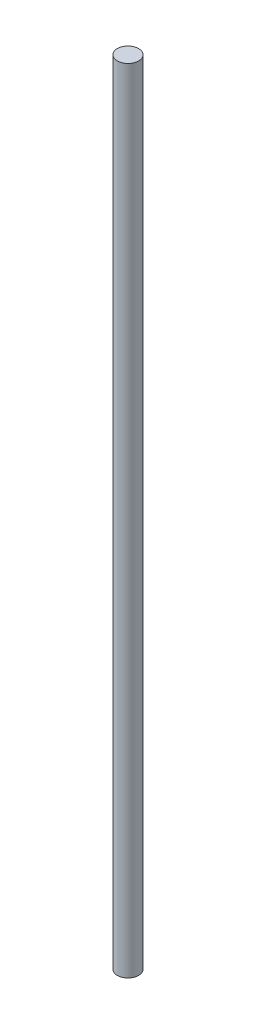
ISO-10303-21;
HEADER;
FILE_DESCRIPTION(('STEP AP214'),'2;1');
FILE_NAME('part.step','',(''),(''),'','','');
FILE_SCHEMA(('AUTOMOTIVE_DESIGN { 1 0 10303 214 1 1 1 1 }'));
ENDSEC;
DATA;
#1=APPLICATION_CONTEXT('core data for automotive mechanical design processes');
#2=APPLICATION_PROTOCOL_DEFINITION('international standard','automotive_design',2000,#1);
#3=PRODUCT_CONTEXT('',#1,'mechanical');
#4=PRODUCT('Part','Part','',(#3));
#5=PRODUCT_RELATED_PRODUCT_CATEGORY('part','',(#4));
#6=PRODUCT_DEFINITION_FORMATION('','',#4);
#7=PRODUCT_DEFINITION_CONTEXT('part definition',#1,'design');
#8=PRODUCT_DEFINITION('design','',#6,#7);
#9=PRODUCT_DEFINITION_SHAPE('','',#8);
#10=(LENGTH_UNIT() NAMED_UNIT(*) SI_UNIT(.MILLI.,.METRE.));
#11=(NAMED_UNIT(*) PLANE_ANGLE_UNIT() SI_UNIT($,.RADIAN.));
#12=(NAMED_UNIT(*) SI_UNIT($,.STERADIAN.) SOLID_ANGLE_UNIT());
#13=UNCERTAINTY_MEASURE_WITH_UNIT(LENGTH_MEASURE(1.E-05),#10,'distance_accuracy_value','');
#14=(GEOMETRIC_REPRESENTATION_CONTEXT(3) GLOBAL_UNCERTAINTY_ASSIGNED_CONTEXT((#13)) GLOBAL_UNIT_ASSIGNED_CONTEXT((#10,
#11,#12)) REPRESENTATION_CONTEXT('',''));
#15=CARTESIAN_POINT('',(0.,0.,0.));
#16=DIRECTION('',(0.,0.,1.));
#17=DIRECTION('',(1.,0.,0.));
#18=AXIS2_PLACEMENT_3D('',#15,#16,#17);
#19=CARTESIAN_POINT('',(0.,234.95,0.));
#20=DIRECTION('',(0.,-1.,0.));
#21=DIRECTION('',(0.,0.,-1.));
#22=AXIS2_PLACEMENT_3D('',#19,#20,#21);
#23=CYLINDRICAL_SURFACE('',#22,3.175);
#24=CARTESIAN_POINT('',(0.,234.95,0.));
#25=DIRECTION('',(0.,1.,0.));
#26=DIRECTION('',(0.,0.,1.));
#27=AXIS2_PLACEMENT_3D('',#24,#25,#26);
#28=CIRCLE('',#27,3.175);
#29=CARTESIAN_POINT('',(0.,234.95,3.175));
#30=VERTEX_POINT('',#29);
#31=EDGE_CURVE('E10',#30,#30,#28,.T.);
#32=ORIENTED_EDGE('',*,*,#31,.F.);
#33=EDGE_LOOP('',(#32));
#34=FACE_BOUND('',#33,.T.);
#35=CARTESIAN_POINT('',(0.,0.,0.));
#36=DIRECTION('',(0.,1.,0.));
#37=DIRECTION('',(0.,0.,1.));
#38=AXIS2_PLACEMENT_3D('',#35,#36,#37);
#39=CIRCLE('',#38,3.175);
#40=CARTESIAN_POINT('',(0.,0.,3.175));
#41=VERTEX_POINT('',#40);
#42=EDGE_CURVE('E33',#41,#41,#39,.T.);
#43=ORIENTED_EDGE('',*,*,#42,.T.);
#44=EDGE_LOOP('',(#43));
#45=FACE_BOUND('',#44,.T.);
#46=ADVANCED_FACE('F30',(#34,#45),#23,.T.);
#47=CARTESIAN_POINT('',(0.,234.95,0.));
#48=DIRECTION('',(0.,1.,0.));
#49=DIRECTION('',(0.,0.,1.));
#50=AXIS2_PLACEMENT_3D('',#47,#48,#49);
#51=PLANE('',#50);
#52=ORIENTED_EDGE('',*,*,#31,.T.);
#53=EDGE_LOOP('',(#52));
#54=FACE_BOUND('',#53,.T.);
#55=ADVANCED_FACE('F45',(#54),#51,.T.);
#56=CARTESIAN_POINT('',(0.,0.,0.));
#57=DIRECTION('',(0.,1.,0.));
#58=DIRECTION('',(0.,0.,1.));
#59=AXIS2_PLACEMENT_3D('',#56,#57,#58);
#60=PLANE('',#59);
#61=ORIENTED_EDGE('',*,*,#42,.F.);
#62=EDGE_LOOP('',(#61));
#63=FACE_BOUND('',#62,.T.);
#64=ADVANCED_FACE('F43',(#63),#60,.F.);
#65=CLOSED_SHELL('',(#46,#55,#64));
#66=MANIFOLD_SOLID_BREP('B2',#65);
#67=ADVANCED_BREP_SHAPE_REPRESENTATION('',(#18,#66),#14);
#68=SHAPE_DEFINITION_REPRESENTATION(#9,#67);
ENDSEC;
END-ISO-10303-21;
